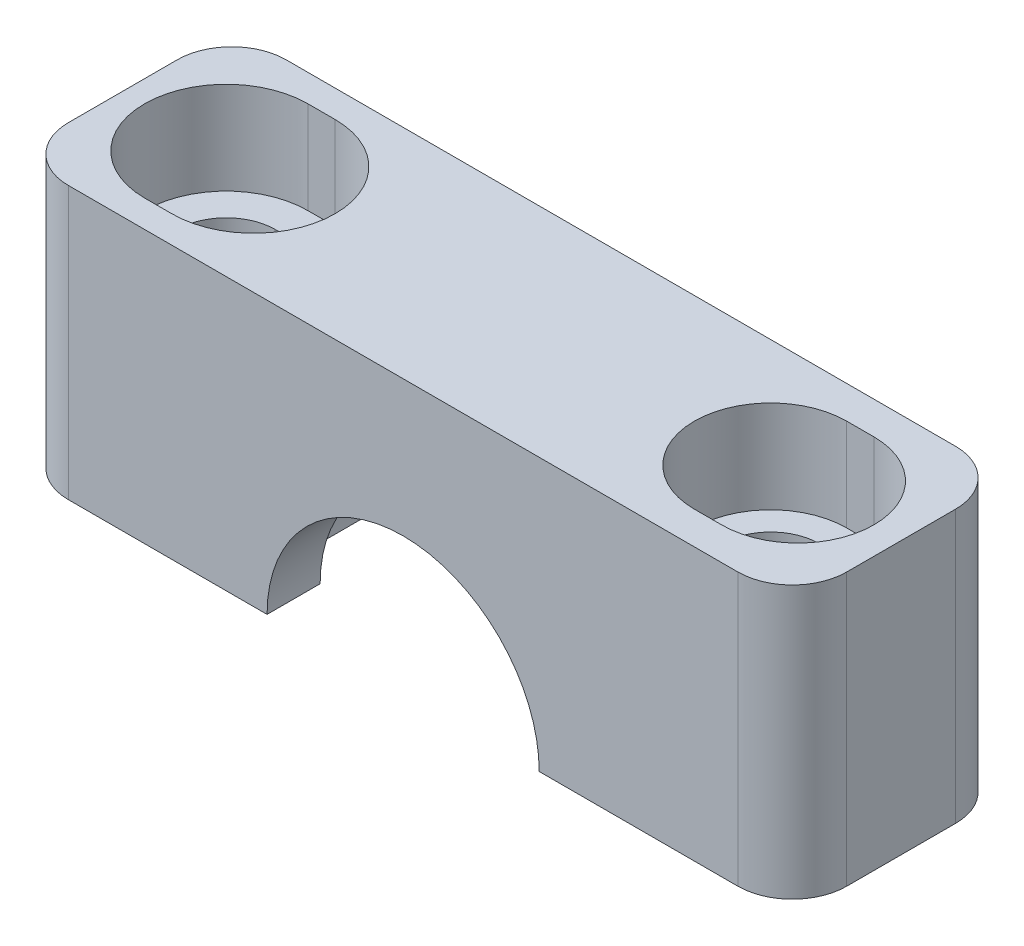
ISO-10303-21;
HEADER;
FILE_DESCRIPTION(('STEP AP214'),'2;1');
FILE_NAME('part.step','',(''),(''),'','','');
FILE_SCHEMA(('AUTOMOTIVE_DESIGN { 1 0 10303 214 1 1 1 1 }'));
ENDSEC;
DATA;
#1=APPLICATION_CONTEXT('core data for automotive mechanical design processes');
#2=APPLICATION_PROTOCOL_DEFINITION('international standard','automotive_design',2000,#1);
#3=PRODUCT_CONTEXT('',#1,'mechanical');
#4=PRODUCT('Part','Part','',(#3));
#5=PRODUCT_RELATED_PRODUCT_CATEGORY('part','',(#4));
#6=PRODUCT_DEFINITION_FORMATION('','',#4);
#7=PRODUCT_DEFINITION_CONTEXT('part definition',#1,'design');
#8=PRODUCT_DEFINITION('design','',#6,#7);
#9=PRODUCT_DEFINITION_SHAPE('','',#8);
#10=(LENGTH_UNIT() NAMED_UNIT(*) SI_UNIT(.MILLI.,.METRE.));
#11=(NAMED_UNIT(*) PLANE_ANGLE_UNIT() SI_UNIT($,.RADIAN.));
#12=(NAMED_UNIT(*) SI_UNIT($,.STERADIAN.) SOLID_ANGLE_UNIT());
#13=UNCERTAINTY_MEASURE_WITH_UNIT(LENGTH_MEASURE(1.E-05),#10,'distance_accuracy_value','');
#14=(GEOMETRIC_REPRESENTATION_CONTEXT(3) GLOBAL_UNCERTAINTY_ASSIGNED_CONTEXT((#13)) GLOBAL_UNIT_ASSIGNED_CONTEXT((#10,
#11,#12)) REPRESENTATION_CONTEXT('',''));
#15=CARTESIAN_POINT('',(0.,0.,0.));
#16=DIRECTION('',(0.,0.,1.));
#17=DIRECTION('',(1.,0.,0.));
#18=AXIS2_PLACEMENT_3D('',#15,#16,#17);
#19=CARTESIAN_POINT('',(12.065,12.7,0.));
#20=DIRECTION('',(0.,-1.,0.));
#21=DIRECTION('',(0.,0.,-1.));
#22=AXIS2_PLACEMENT_3D('',#19,#20,#21);
#23=CYLINDRICAL_SURFACE('',#22,2.28599999999999);
#24=CARTESIAN_POINT('',(12.065,8.382,0.));
#25=DIRECTION('',(0.,1.,0.));
#26=DIRECTION('',(0.,0.,1.));
#27=AXIS2_PLACEMENT_3D('',#24,#25,#26);
#28=CIRCLE('',#27,2.28599999999999);
#29=CARTESIAN_POINT('',(12.065,8.382,2.28599999999999));
#30=VERTEX_POINT('',#29);
#31=CARTESIAN_POINT('',(12.065,8.382,-2.28599999999999));
#32=VERTEX_POINT('',#31);
#33=EDGE_CURVE('E56',#30,#32,#28,.F.);
#34=ORIENTED_EDGE('',*,*,#33,.F.);
#35=DIRECTION('',(0.,-1.,0.));
#36=VECTOR('',#35,1.);
#37=CARTESIAN_POINT('',(12.065,12.7,2.28599999999999));
#38=LINE('',#37,#36);
#39=CARTESIAN_POINT('',(12.065,0.,2.28599999999999));
#40=VERTEX_POINT('',#39);
#41=EDGE_CURVE('E344',#30,#40,#38,.T.);
#42=ORIENTED_EDGE('',*,*,#41,.T.);
#43=CARTESIAN_POINT('',(12.065,0.,0.));
#44=DIRECTION('',(0.,-1.,0.));
#45=DIRECTION('',(0.,0.,-1.));
#46=AXIS2_PLACEMENT_3D('',#43,#44,#45);
#47=CIRCLE('',#46,2.28599999999999);
#48=CARTESIAN_POINT('',(12.065,0.,-2.28599999999999));
#49=VERTEX_POINT('',#48);
#50=EDGE_CURVE('E326',#40,#49,#47,.T.);
#51=ORIENTED_EDGE('',*,*,#50,.T.);
#52=DIRECTION('',(0.,-1.,0.));
#53=VECTOR('',#52,1.);
#54=CARTESIAN_POINT('',(12.065,12.7,-2.28599999999999));
#55=LINE('',#54,#53);
#56=EDGE_CURVE('E343',#32,#49,#55,.T.);
#57=ORIENTED_EDGE('',*,*,#56,.F.);
#58=EDGE_LOOP('',(#34,#42,#51,#57));
#59=FACE_BOUND('',#58,.T.);
#60=ADVANCED_FACE('F34',(#59),#23,.F.);
#61=CARTESIAN_POINT('',(12.065,12.7,2.28599999999999));
#62=DIRECTION('',(0.,0.,1.));
#63=DIRECTION('',(1.,0.,0.));
#64=AXIS2_PLACEMENT_3D('',#61,#62,#63);
#65=PLANE('',#64);
#66=DIRECTION('',(-1.,0.,0.));
#67=VECTOR('',#66,1.);
#68=CARTESIAN_POINT('',(12.065,8.382,2.28599999999999));
#69=LINE('',#68,#67);
#70=CARTESIAN_POINT('',(13.335,8.382,2.286));
#71=VERTEX_POINT('',#70);
#72=EDGE_CURVE('E270',#71,#30,#69,.T.);
#73=ORIENTED_EDGE('',*,*,#72,.F.);
#74=DIRECTION('',(0.,-1.,0.));
#75=VECTOR('',#74,1.);
#76=CARTESIAN_POINT('',(13.335,12.7,2.286));
#77=LINE('',#76,#75);
#78=CARTESIAN_POINT('',(13.335,0.,2.286));
#79=VERTEX_POINT('',#78);
#80=EDGE_CURVE('E347',#71,#79,#77,.T.);
#81=ORIENTED_EDGE('',*,*,#80,.T.);
#82=DIRECTION('',(-1.,0.,0.));
#83=VECTOR('',#82,1.);
#84=CARTESIAN_POINT('',(12.065,0.,2.28599999999999));
#85=LINE('',#84,#83);
#86=EDGE_CURVE('E340',#79,#40,#85,.T.);
#87=ORIENTED_EDGE('',*,*,#86,.T.);
#88=ORIENTED_EDGE('',*,*,#41,.F.);
#89=EDGE_LOOP('',(#73,#81,#87,#88));
#90=FACE_BOUND('',#89,.T.);
#91=ADVANCED_FACE('F487',(#90),#65,.F.);
#92=CARTESIAN_POINT('',(13.335,12.7,0.));
#93=DIRECTION('',(0.,-1.,0.));
#94=DIRECTION('',(0.,0.,-1.));
#95=AXIS2_PLACEMENT_3D('',#92,#93,#94);
#96=CYLINDRICAL_SURFACE('',#95,2.286);
#97=CARTESIAN_POINT('',(13.335,8.382,0.));
#98=DIRECTION('',(0.,1.,0.));
#99=DIRECTION('',(0.,0.,1.));
#100=AXIS2_PLACEMENT_3D('',#97,#98,#99);
#101=CIRCLE('',#100,2.286);
#102=CARTESIAN_POINT('',(13.335,8.382,-2.286));
#103=VERTEX_POINT('',#102);
#104=EDGE_CURVE('E265',#103,#71,#101,.F.);
#105=ORIENTED_EDGE('',*,*,#104,.F.);
#106=DIRECTION('',(0.,-1.,0.));
#107=VECTOR('',#106,1.);
#108=CARTESIAN_POINT('',(13.335,12.7,-2.286));
#109=LINE('',#108,#107);
#110=CARTESIAN_POINT('',(13.335,0.,-2.286));
#111=VERTEX_POINT('',#110);
#112=EDGE_CURVE('E349',#103,#111,#109,.T.);
#113=ORIENTED_EDGE('',*,*,#112,.T.);
#114=CARTESIAN_POINT('',(13.335,0.,0.));
#115=DIRECTION('',(0.,-1.,0.));
#116=DIRECTION('',(0.,0.,-1.));
#117=AXIS2_PLACEMENT_3D('',#114,#115,#116);
#118=CIRCLE('',#117,2.286);
#119=EDGE_CURVE('E337',#111,#79,#118,.T.);
#120=ORIENTED_EDGE('',*,*,#119,.T.);
#121=ORIENTED_EDGE('',*,*,#80,.F.);
#122=EDGE_LOOP('',(#105,#113,#120,#121));
#123=FACE_BOUND('',#122,.T.);
#124=ADVANCED_FACE('F481',(#123),#96,.F.);
#125=CARTESIAN_POINT('',(12.065,12.7,-2.28599999999999));
#126=DIRECTION('',(0.,0.,-1.));
#127=DIRECTION('',(-1.,0.,0.));
#128=AXIS2_PLACEMENT_3D('',#125,#126,#127);
#129=PLANE('',#128);
#130=DIRECTION('',(1.,0.,0.));
#131=VECTOR('',#130,1.);
#132=CARTESIAN_POINT('',(12.065,8.382,-2.28599999999999));
#133=LINE('',#132,#131);
#134=EDGE_CURVE('E11',#32,#103,#133,.T.);
#135=ORIENTED_EDGE('',*,*,#134,.F.);
#136=ORIENTED_EDGE('',*,*,#56,.T.);
#137=DIRECTION('',(1.,0.,0.));
#138=VECTOR('',#137,1.);
#139=CARTESIAN_POINT('',(12.065,0.,-2.28599999999999));
#140=LINE('',#139,#138);
#141=EDGE_CURVE('E334',#49,#111,#140,.T.);
#142=ORIENTED_EDGE('',*,*,#141,.T.);
#143=ORIENTED_EDGE('',*,*,#112,.F.);
#144=EDGE_LOOP('',(#135,#136,#142,#143));
#145=FACE_BOUND('',#144,.T.);
#146=ADVANCED_FACE('F474',(#145),#129,.F.);
#147=CARTESIAN_POINT('',(-13.335,12.7,0.));
#148=DIRECTION('',(0.,-1.,0.));
#149=DIRECTION('',(0.,0.,-1.));
#150=AXIS2_PLACEMENT_3D('',#147,#148,#149);
#151=CYLINDRICAL_SURFACE('',#150,2.286);
#152=CARTESIAN_POINT('',(-13.335,8.382,0.));
#153=DIRECTION('',(0.,1.,0.));
#154=DIRECTION('',(0.,0.,1.));
#155=AXIS2_PLACEMENT_3D('',#152,#153,#154);
#156=CIRCLE('',#155,2.286);
#157=CARTESIAN_POINT('',(-13.335,8.382,2.286));
#158=VERTEX_POINT('',#157);
#159=CARTESIAN_POINT('',(-13.335,8.382,-2.286));
#160=VERTEX_POINT('',#159);
#161=EDGE_CURVE('E309',#158,#160,#156,.F.);
#162=ORIENTED_EDGE('',*,*,#161,.F.);
#163=DIRECTION('',(0.,-1.,0.));
#164=VECTOR('',#163,1.);
#165=CARTESIAN_POINT('',(-13.335,12.7,2.286));
#166=LINE('',#165,#164);
#167=CARTESIAN_POINT('',(-13.335,0.,2.286));
#168=VERTEX_POINT('',#167);
#169=EDGE_CURVE('E324',#158,#168,#166,.T.);
#170=ORIENTED_EDGE('',*,*,#169,.T.);
#171=CARTESIAN_POINT('',(-13.335,0.,0.));
#172=DIRECTION('',(0.,-1.,0.));
#173=DIRECTION('',(0.,0.,-1.));
#174=AXIS2_PLACEMENT_3D('',#171,#172,#173);
#175=CIRCLE('',#174,2.286);
#176=CARTESIAN_POINT('',(-13.335,0.,-2.286));
#177=VERTEX_POINT('',#176);
#178=EDGE_CURVE('E311',#168,#177,#175,.T.);
#179=ORIENTED_EDGE('',*,*,#178,.T.);
#180=DIRECTION('',(0.,-1.,0.));
#181=VECTOR('',#180,1.);
#182=CARTESIAN_POINT('',(-13.335,12.7,-2.286));
#183=LINE('',#182,#181);
#184=EDGE_CURVE('E323',#160,#177,#183,.T.);
#185=ORIENTED_EDGE('',*,*,#184,.F.);
#186=EDGE_LOOP('',(#162,#170,#179,#185));
#187=FACE_BOUND('',#186,.T.);
#188=ADVANCED_FACE('F472',(#187),#151,.F.);
#189=CARTESIAN_POINT('',(-13.335,12.7,2.286));
#190=DIRECTION('',(0.,0.,1.));
#191=DIRECTION('',(1.,0.,0.));
#192=AXIS2_PLACEMENT_3D('',#189,#190,#191);
#193=PLANE('',#192);
#194=DIRECTION('',(-1.,0.,0.));
#195=VECTOR('',#194,1.);
#196=CARTESIAN_POINT('',(-13.335,8.382,2.286));
#197=LINE('',#196,#195);
#198=CARTESIAN_POINT('',(-12.065,8.382,2.286));
#199=VERTEX_POINT('',#198);
#200=EDGE_CURVE('E307',#199,#158,#197,.T.);
#201=ORIENTED_EDGE('',*,*,#200,.F.);
#202=DIRECTION('',(0.,-1.,0.));
#203=VECTOR('',#202,1.);
#204=CARTESIAN_POINT('',(-12.065,12.7,2.286));
#205=LINE('',#204,#203);
#206=CARTESIAN_POINT('',(-12.065,0.,2.286));
#207=VERTEX_POINT('',#206);
#208=EDGE_CURVE('E327',#199,#207,#205,.T.);
#209=ORIENTED_EDGE('',*,*,#208,.T.);
#210=DIRECTION('',(-1.,0.,0.));
#211=VECTOR('',#210,1.);
#212=CARTESIAN_POINT('',(-13.335,0.,2.286));
#213=LINE('',#212,#211);
#214=EDGE_CURVE('E320',#207,#168,#213,.T.);
#215=ORIENTED_EDGE('',*,*,#214,.T.);
#216=ORIENTED_EDGE('',*,*,#169,.F.);
#217=EDGE_LOOP('',(#201,#209,#215,#216));
#218=FACE_BOUND('',#217,.T.);
#219=ADVANCED_FACE('F470',(#218),#193,.F.);
#220=CARTESIAN_POINT('',(-12.065,12.7,0.));
#221=DIRECTION('',(0.,-1.,0.));
#222=DIRECTION('',(0.,0.,-1.));
#223=AXIS2_PLACEMENT_3D('',#220,#221,#222);
#224=CYLINDRICAL_SURFACE('',#223,2.286);
#225=CARTESIAN_POINT('',(-12.065,8.382,0.));
#226=DIRECTION('',(0.,1.,0.));
#227=DIRECTION('',(0.,0.,1.));
#228=AXIS2_PLACEMENT_3D('',#225,#226,#227);
#229=CIRCLE('',#228,2.286);
#230=CARTESIAN_POINT('',(-12.065,8.382,-2.286));
#231=VERTEX_POINT('',#230);
#232=EDGE_CURVE('E299',#231,#199,#229,.F.);
#233=ORIENTED_EDGE('',*,*,#232,.F.);
#234=DIRECTION('',(0.,-1.,0.));
#235=VECTOR('',#234,1.);
#236=CARTESIAN_POINT('',(-12.065,12.7,-2.286));
#237=LINE('',#236,#235);
#238=CARTESIAN_POINT('',(-12.065,0.,-2.286));
#239=VERTEX_POINT('',#238);
#240=EDGE_CURVE('E329',#231,#239,#237,.T.);
#241=ORIENTED_EDGE('',*,*,#240,.T.);
#242=CARTESIAN_POINT('',(-12.065,0.,0.));
#243=DIRECTION('',(0.,-1.,0.));
#244=DIRECTION('',(0.,0.,-1.));
#245=AXIS2_PLACEMENT_3D('',#242,#243,#244);
#246=CIRCLE('',#245,2.286);
#247=EDGE_CURVE('E317',#239,#207,#246,.T.);
#248=ORIENTED_EDGE('',*,*,#247,.T.);
#249=ORIENTED_EDGE('',*,*,#208,.F.);
#250=EDGE_LOOP('',(#233,#241,#248,#249));
#251=FACE_BOUND('',#250,.T.);
#252=ADVANCED_FACE('F459',(#251),#224,.F.);
#253=CARTESIAN_POINT('',(-13.335,12.7,-2.286));
#254=DIRECTION('',(0.,0.,-1.));
#255=DIRECTION('',(-1.,0.,0.));
#256=AXIS2_PLACEMENT_3D('',#253,#254,#255);
#257=PLANE('',#256);
#258=DIRECTION('',(1.,0.,0.));
#259=VECTOR('',#258,1.);
#260=CARTESIAN_POINT('',(-13.335,8.382,-2.286));
#261=LINE('',#260,#259);
#262=EDGE_CURVE('E42',#160,#231,#261,.T.);
#263=ORIENTED_EDGE('',*,*,#262,.F.);
#264=ORIENTED_EDGE('',*,*,#184,.T.);
#265=DIRECTION('',(1.,0.,0.));
#266=VECTOR('',#265,1.);
#267=CARTESIAN_POINT('',(-13.335,0.,-2.286));
#268=LINE('',#267,#266);
#269=EDGE_CURVE('E314',#177,#239,#268,.T.);
#270=ORIENTED_EDGE('',*,*,#269,.T.);
#271=ORIENTED_EDGE('',*,*,#240,.F.);
#272=EDGE_LOOP('',(#263,#264,#270,#271));
#273=FACE_BOUND('',#272,.T.);
#274=ADVANCED_FACE('F460',(#273),#257,.F.);
#275=CARTESIAN_POINT('',(0.,0.,-5.08));
#276=DIRECTION('',(0.,0.,1.));
#277=DIRECTION('',(1.,0.,0.));
#278=AXIS2_PLACEMENT_3D('',#275,#276,#277);
#279=CYLINDRICAL_SURFACE('',#278,6.35);
#280=CARTESIAN_POINT('',(0.,0.,2.6035));
#281=DIRECTION('',(0.,0.,-1.));
#282=DIRECTION('',(-1.,0.,0.));
#283=AXIS2_PLACEMENT_3D('',#280,#281,#282);
#284=CIRCLE('',#283,6.35);
#285=CARTESIAN_POINT('',(6.35,0.,2.6035));
#286=VERTEX_POINT('',#285);
#287=CARTESIAN_POINT('',(-6.35,0.,2.6035));
#288=VERTEX_POINT('',#287);
#289=EDGE_CURVE('E444',#286,#288,#284,.F.);
#290=ORIENTED_EDGE('',*,*,#289,.F.);
#291=DIRECTION('',(0.,0.,1.));
#292=VECTOR('',#291,1.);
#293=CARTESIAN_POINT('',(6.35,0.,-5.08));
#294=LINE('',#293,#292);
#295=CARTESIAN_POINT('',(6.35,0.,5.08));
#296=VERTEX_POINT('',#295);
#297=EDGE_CURVE('E379',#286,#296,#294,.T.);
#298=ORIENTED_EDGE('',*,*,#297,.T.);
#299=CARTESIAN_POINT('',(0.,0.,5.08));
#300=DIRECTION('',(0.,0.,1.));
#301=DIRECTION('',(-1.,0.,0.));
#302=AXIS2_PLACEMENT_3D('',#299,#300,#301);
#303=CIRCLE('',#302,6.35);
#304=CARTESIAN_POINT('',(-6.35,0.,5.08));
#305=VERTEX_POINT('',#304);
#306=EDGE_CURVE('E366',#296,#305,#303,.T.);
#307=ORIENTED_EDGE('',*,*,#306,.T.);
#308=DIRECTION('',(0.,0.,1.));
#309=VECTOR('',#308,1.);
#310=CARTESIAN_POINT('',(-6.35,0.,-5.08));
#311=LINE('',#310,#309);
#312=EDGE_CURVE('E372',#288,#305,#311,.T.);
#313=ORIENTED_EDGE('',*,*,#312,.F.);
#314=EDGE_LOOP('',(#290,#298,#307,#313));
#315=FACE_BOUND('',#314,.T.);
#316=ADVANCED_FACE('F512',(#315),#279,.F.);
#317=CARTESIAN_POINT('',(-15.621,0.,-2.54));
#318=DIRECTION('',(0.,-1.,0.));
#319=DIRECTION('',(0.,0.,-1.));
#320=AXIS2_PLACEMENT_3D('',#317,#318,#319);
#321=PLANE('',#320);
#322=ORIENTED_EDGE('',*,*,#50,.F.);
#323=ORIENTED_EDGE('',*,*,#86,.F.);
#324=ORIENTED_EDGE('',*,*,#119,.F.);
#325=ORIENTED_EDGE('',*,*,#141,.F.);
#326=EDGE_LOOP('',(#322,#323,#324,#325));
#327=FACE_BOUND('',#326,.T.);
#328=DIRECTION('',(1.,0.,0.));
#329=VECTOR('',#328,1.);
#330=CARTESIAN_POINT('',(-8.001,0.,-2.6035));
#331=LINE('',#330,#329);
#332=CARTESIAN_POINT('',(6.35,0.,-2.6035));
#333=VERTEX_POINT('',#332);
#334=CARTESIAN_POINT('',(8.001,0.,-2.6035));
#335=VERTEX_POINT('',#334);
#336=EDGE_CURVE('E355',#333,#335,#331,.T.);
#337=ORIENTED_EDGE('',*,*,#336,.F.);
#338=CARTESIAN_POINT('',(6.35,0.,-5.08));
#339=VERTEX_POINT('',#338);
#340=EDGE_CURVE('E375',#339,#333,#294,.T.);
#341=ORIENTED_EDGE('',*,*,#340,.F.);
#342=DIRECTION('',(-1.,0.,0.));
#343=VECTOR('',#342,1.);
#344=CARTESIAN_POINT('',(-15.621,0.,-5.08));
#345=LINE('',#344,#343);
#346=CARTESIAN_POINT('',(15.621,0.,-5.08));
#347=VERTEX_POINT('',#346);
#348=EDGE_CURVE('E387',#347,#339,#345,.T.);
#349=ORIENTED_EDGE('',*,*,#348,.F.);
#350=CARTESIAN_POINT('',(15.621,0.,-2.54));
#351=DIRECTION('',(0.,1.,0.));
#352=DIRECTION('',(0.,0.,-1.));
#353=AXIS2_PLACEMENT_3D('',#350,#351,#352);
#354=CIRCLE('',#353,2.54);
#355=CARTESIAN_POINT('',(18.161,0.,-2.53999999999998));
#356=VERTEX_POINT('',#355);
#357=EDGE_CURVE('E416',#356,#347,#354,.T.);
#358=ORIENTED_EDGE('',*,*,#357,.F.);
#359=DIRECTION('',(0.,0.,-1.));
#360=VECTOR('',#359,1.);
#361=CARTESIAN_POINT('',(18.161,0.,2.53999999999998));
#362=LINE('',#361,#360);
#363=CARTESIAN_POINT('',(18.161,0.,2.53999999999998));
#364=VERTEX_POINT('',#363);
#365=EDGE_CURVE('E414',#364,#356,#362,.T.);
#366=ORIENTED_EDGE('',*,*,#365,.F.);
#367=CARTESIAN_POINT('',(15.621,0.,2.54));
#368=DIRECTION('',(0.,1.,0.));
#369=DIRECTION('',(0.,0.,1.));
#370=AXIS2_PLACEMENT_3D('',#367,#368,#369);
#371=CIRCLE('',#370,2.54);
#372=CARTESIAN_POINT('',(15.621,0.,5.08));
#373=VERTEX_POINT('',#372);
#374=EDGE_CURVE('E412',#373,#364,#371,.T.);
#375=ORIENTED_EDGE('',*,*,#374,.F.);
#376=DIRECTION('',(1.,0.,0.));
#377=VECTOR('',#376,1.);
#378=CARTESIAN_POINT('',(-15.621,0.,5.08));
#379=LINE('',#378,#377);
#380=EDGE_CURVE('E408',#296,#373,#379,.T.);
#381=ORIENTED_EDGE('',*,*,#380,.F.);
#382=ORIENTED_EDGE('',*,*,#297,.F.);
#383=DIRECTION('',(1.,0.,0.));
#384=VECTOR('',#383,1.);
#385=CARTESIAN_POINT('',(-8.001,0.,2.6035));
#386=LINE('',#385,#384);
#387=CARTESIAN_POINT('',(8.001,0.,2.6035));
#388=VERTEX_POINT('',#387);
#389=EDGE_CURVE('E361',#286,#388,#386,.T.);
#390=ORIENTED_EDGE('',*,*,#389,.T.);
#391=DIRECTION('',(0.,0.,1.));
#392=VECTOR('',#391,1.);
#393=CARTESIAN_POINT('',(8.001,0.,-2.6035));
#394=LINE('',#393,#392);
#395=EDGE_CURVE('E364',#335,#388,#394,.T.);
#396=ORIENTED_EDGE('',*,*,#395,.F.);
#397=EDGE_LOOP('',(#337,#341,#349,#358,#366,#375,#381,#382,#390,#396));
#398=FACE_BOUND('',#397,.T.);
#399=ADVANCED_FACE('F520',(#327,#398),#321,.T.);
#400=CARTESIAN_POINT('',(-15.621,12.7,-2.54));
#401=DIRECTION('',(0.,-1.,0.));
#402=DIRECTION('',(0.,0.,-1.));
#403=AXIS2_PLACEMENT_3D('',#400,#401,#402);
#404=CYLINDRICAL_SURFACE('',#403,2.54);
#405=CARTESIAN_POINT('',(-15.621,0.,-2.54));
#406=DIRECTION('',(0.,1.,0.));
#407=DIRECTION('',(0.,0.,-1.));
#408=AXIS2_PLACEMENT_3D('',#405,#406,#407);
#409=CIRCLE('',#408,2.54);
#410=CARTESIAN_POINT('',(-15.621,0.,-5.08));
#411=VERTEX_POINT('',#410);
#412=CARTESIAN_POINT('',(-18.161,0.,-2.53999999999998));
#413=VERTEX_POINT('',#412);
#414=EDGE_CURVE('E378',#411,#413,#409,.T.);
#415=ORIENTED_EDGE('',*,*,#414,.T.);
#416=DIRECTION('',(0.,-1.,0.));
#417=VECTOR('',#416,1.);
#418=CARTESIAN_POINT('',(-18.161,12.7,-2.53999999999998));
#419=LINE('',#418,#417);
#420=CARTESIAN_POINT('',(-18.161,12.7,-2.53999999999998));
#421=VERTEX_POINT('',#420);
#422=EDGE_CURVE('E441',#421,#413,#419,.T.);
#423=ORIENTED_EDGE('',*,*,#422,.F.);
#424=CARTESIAN_POINT('',(-15.621,12.7,-2.54));
#425=DIRECTION('',(0.,1.,0.));
#426=DIRECTION('',(0.,0.,-1.));
#427=AXIS2_PLACEMENT_3D('',#424,#425,#426);
#428=CIRCLE('',#427,2.54);
#429=CARTESIAN_POINT('',(-15.621,12.7,-5.08));
#430=VERTEX_POINT('',#429);
#431=EDGE_CURVE('E383',#430,#421,#428,.T.);
#432=ORIENTED_EDGE('',*,*,#431,.F.);
#433=DIRECTION('',(0.,-1.,0.));
#434=VECTOR('',#433,1.);
#435=CARTESIAN_POINT('',(-15.621,12.7,-5.08));
#436=LINE('',#435,#434);
#437=EDGE_CURVE('E401',#430,#411,#436,.T.);
#438=ORIENTED_EDGE('',*,*,#437,.T.);
#439=EDGE_LOOP('',(#415,#423,#432,#438));
#440=FACE_BOUND('',#439,.T.);
#441=ADVANCED_FACE('F36',(#440),#404,.T.);
#442=CARTESIAN_POINT('',(-18.161,12.7,2.53999999999998));
#443=DIRECTION('',(1.,0.,0.));
#444=DIRECTION('',(0.,0.,-1.));
#445=AXIS2_PLACEMENT_3D('',#442,#443,#444);
#446=PLANE('',#445);
#447=DIRECTION('',(0.,0.,1.));
#448=VECTOR('',#447,1.);
#449=CARTESIAN_POINT('',(-18.161,0.,2.53999999999998));
#450=LINE('',#449,#448);
#451=CARTESIAN_POINT('',(-18.161,0.,2.53999999999998));
#452=VERTEX_POINT('',#451);
#453=EDGE_CURVE('E404',#413,#452,#450,.T.);
#454=ORIENTED_EDGE('',*,*,#453,.T.);
#455=DIRECTION('',(0.,-1.,0.));
#456=VECTOR('',#455,1.);
#457=CARTESIAN_POINT('',(-18.161,12.7,2.53999999999998));
#458=LINE('',#457,#456);
#459=CARTESIAN_POINT('',(-18.161,12.7,2.53999999999998));
#460=VERTEX_POINT('',#459);
#461=EDGE_CURVE('E438',#460,#452,#458,.T.);
#462=ORIENTED_EDGE('',*,*,#461,.F.);
#463=DIRECTION('',(0.,0.,1.));
#464=VECTOR('',#463,1.);
#465=CARTESIAN_POINT('',(-18.161,12.7,2.53999999999998));
#466=LINE('',#465,#464);
#467=EDGE_CURVE('E386',#421,#460,#466,.T.);
#468=ORIENTED_EDGE('',*,*,#467,.F.);
#469=ORIENTED_EDGE('',*,*,#422,.T.);
#470=EDGE_LOOP('',(#454,#462,#468,#469));
#471=FACE_BOUND('',#470,.T.);
#472=ADVANCED_FACE('F542',(#471),#446,.F.);
#473=CARTESIAN_POINT('',(-15.621,12.7,2.54));
#474=DIRECTION('',(0.,-1.,0.));
#475=DIRECTION('',(0.,0.,-1.));
#476=AXIS2_PLACEMENT_3D('',#473,#474,#475);
#477=CYLINDRICAL_SURFACE('',#476,2.54);
#478=CARTESIAN_POINT('',(-15.621,0.,2.54));
#479=DIRECTION('',(0.,1.,0.));
#480=DIRECTION('',(0.,0.,-1.));
#481=AXIS2_PLACEMENT_3D('',#478,#479,#480);
#482=CIRCLE('',#481,2.54);
#483=CARTESIAN_POINT('',(-15.621,0.,5.08));
#484=VERTEX_POINT('',#483);
#485=EDGE_CURVE('E406',#452,#484,#482,.T.);
#486=ORIENTED_EDGE('',*,*,#485,.T.);
#487=DIRECTION('',(0.,-1.,0.));
#488=VECTOR('',#487,1.);
#489=CARTESIAN_POINT('',(-15.621,12.7,5.08));
#490=LINE('',#489,#488);
#491=CARTESIAN_POINT('',(-15.621,12.7,5.08));
#492=VERTEX_POINT('',#491);
#493=EDGE_CURVE('E435',#492,#484,#490,.T.);
#494=ORIENTED_EDGE('',*,*,#493,.F.);
#495=CARTESIAN_POINT('',(-15.621,12.7,2.54));
#496=DIRECTION('',(0.,1.,0.));
#497=DIRECTION('',(0.,0.,-1.));
#498=AXIS2_PLACEMENT_3D('',#495,#496,#497);
#499=CIRCLE('',#498,2.54);
#500=EDGE_CURVE('E389',#460,#492,#499,.T.);
#501=ORIENTED_EDGE('',*,*,#500,.F.);
#502=ORIENTED_EDGE('',*,*,#461,.T.);
#503=EDGE_LOOP('',(#486,#494,#501,#502));
#504=FACE_BOUND('',#503,.T.);
#505=ADVANCED_FACE('F539',(#504),#477,.T.);
#506=CARTESIAN_POINT('',(-15.621,12.7,5.08));
#507=DIRECTION('',(0.,0.,-1.));
#508=DIRECTION('',(-1.,0.,0.));
#509=AXIS2_PLACEMENT_3D('',#506,#507,#508);
#510=PLANE('',#509);
#511=EDGE_CURVE('E409',#484,#305,#379,.T.);
#512=ORIENTED_EDGE('',*,*,#511,.T.);
#513=ORIENTED_EDGE('',*,*,#306,.F.);
#514=ORIENTED_EDGE('',*,*,#380,.T.);
#515=DIRECTION('',(0.,-1.,0.));
#516=VECTOR('',#515,1.);
#517=CARTESIAN_POINT('',(15.621,12.7,5.08));
#518=LINE('',#517,#516);
#519=CARTESIAN_POINT('',(15.621,12.7,5.08));
#520=VERTEX_POINT('',#519);
#521=EDGE_CURVE('E432',#520,#373,#518,.T.);
#522=ORIENTED_EDGE('',*,*,#521,.F.);
#523=DIRECTION('',(1.,0.,0.));
#524=VECTOR('',#523,1.);
#525=CARTESIAN_POINT('',(-15.621,12.7,5.08));
#526=LINE('',#525,#524);
#527=EDGE_CURVE('E391',#492,#520,#526,.T.);
#528=ORIENTED_EDGE('',*,*,#527,.F.);
#529=ORIENTED_EDGE('',*,*,#493,.T.);
#530=EDGE_LOOP('',(#512,#513,#514,#522,#528,#529));
#531=FACE_BOUND('',#530,.T.);
#532=ADVANCED_FACE('F535',(#531),#510,.F.);
#533=CARTESIAN_POINT('',(15.621,12.7,2.54));
#534=DIRECTION('',(0.,-1.,0.));
#535=DIRECTION('',(0.,0.,-1.));
#536=AXIS2_PLACEMENT_3D('',#533,#534,#535);
#537=CYLINDRICAL_SURFACE('',#536,2.54);
#538=ORIENTED_EDGE('',*,*,#374,.T.);
#539=DIRECTION('',(0.,-1.,0.));
#540=VECTOR('',#539,1.);
#541=CARTESIAN_POINT('',(18.161,12.7,2.53999999999998));
#542=LINE('',#541,#540);
#543=CARTESIAN_POINT('',(18.161,12.7,2.53999999999998));
#544=VERTEX_POINT('',#543);
#545=EDGE_CURVE('E429',#544,#364,#542,.T.);
#546=ORIENTED_EDGE('',*,*,#545,.F.);
#547=CARTESIAN_POINT('',(15.621,12.7,2.54));
#548=DIRECTION('',(0.,1.,0.));
#549=DIRECTION('',(0.,0.,1.));
#550=AXIS2_PLACEMENT_3D('',#547,#548,#549);
#551=CIRCLE('',#550,2.54);
#552=EDGE_CURVE('E393',#520,#544,#551,.T.);
#553=ORIENTED_EDGE('',*,*,#552,.F.);
#554=ORIENTED_EDGE('',*,*,#521,.T.);
#555=EDGE_LOOP('',(#538,#546,#553,#554));
#556=FACE_BOUND('',#555,.T.);
#557=ADVANCED_FACE('F531',(#556),#537,.T.);
#558=CARTESIAN_POINT('',(18.161,12.7,2.53999999999998));
#559=DIRECTION('',(-1.,0.,0.));
#560=DIRECTION('',(0.,0.,1.));
#561=AXIS2_PLACEMENT_3D('',#558,#559,#560);
#562=PLANE('',#561);
#563=ORIENTED_EDGE('',*,*,#365,.T.);
#564=DIRECTION('',(0.,-1.,0.));
#565=VECTOR('',#564,1.);
#566=CARTESIAN_POINT('',(18.161,12.7,-2.53999999999998));
#567=LINE('',#566,#565);
#568=CARTESIAN_POINT('',(18.161,12.7,-2.53999999999998));
#569=VERTEX_POINT('',#568);
#570=EDGE_CURVE('E426',#569,#356,#567,.T.);
#571=ORIENTED_EDGE('',*,*,#570,.F.);
#572=DIRECTION('',(0.,0.,-1.));
#573=VECTOR('',#572,1.);
#574=CARTESIAN_POINT('',(18.161,12.7,2.53999999999998));
#575=LINE('',#574,#573);
#576=EDGE_CURVE('E395',#544,#569,#575,.T.);
#577=ORIENTED_EDGE('',*,*,#576,.F.);
#578=ORIENTED_EDGE('',*,*,#545,.T.);
#579=EDGE_LOOP('',(#563,#571,#577,#578));
#580=FACE_BOUND('',#579,.T.);
#581=ADVANCED_FACE('F527',(#580),#562,.F.);
#582=CARTESIAN_POINT('',(15.621,12.7,-2.54));
#583=DIRECTION('',(0.,-1.,0.));
#584=DIRECTION('',(0.,0.,-1.));
#585=AXIS2_PLACEMENT_3D('',#582,#583,#584);
#586=CYLINDRICAL_SURFACE('',#585,2.54);
#587=ORIENTED_EDGE('',*,*,#357,.T.);
#588=DIRECTION('',(0.,-1.,0.));
#589=VECTOR('',#588,1.);
#590=CARTESIAN_POINT('',(15.621,12.7,-5.08));
#591=LINE('',#590,#589);
#592=CARTESIAN_POINT('',(15.621,12.7,-5.08));
#593=VERTEX_POINT('',#592);
#594=EDGE_CURVE('E423',#593,#347,#591,.T.);
#595=ORIENTED_EDGE('',*,*,#594,.F.);
#596=CARTESIAN_POINT('',(15.621,12.7,-2.54));
#597=DIRECTION('',(0.,1.,0.));
#598=DIRECTION('',(0.,0.,-1.));
#599=AXIS2_PLACEMENT_3D('',#596,#597,#598);
#600=CIRCLE('',#599,2.54);
#601=EDGE_CURVE('E397',#569,#593,#600,.T.);
#602=ORIENTED_EDGE('',*,*,#601,.F.);
#603=ORIENTED_EDGE('',*,*,#570,.T.);
#604=EDGE_LOOP('',(#587,#595,#602,#603));
#605=FACE_BOUND('',#604,.T.);
#606=ADVANCED_FACE('F523',(#605),#586,.T.);
#607=CARTESIAN_POINT('',(-15.621,12.7,-5.08));
#608=DIRECTION('',(0.,0.,1.));
#609=DIRECTION('',(1.,0.,0.));
#610=AXIS2_PLACEMENT_3D('',#607,#608,#609);
#611=PLANE('',#610);
#612=ORIENTED_EDGE('',*,*,#348,.T.);
#613=CARTESIAN_POINT('',(0.,0.,-5.08));
#614=DIRECTION('',(0.,0.,1.));
#615=DIRECTION('',(-1.,0.,0.));
#616=AXIS2_PLACEMENT_3D('',#613,#614,#615);
#617=CIRCLE('',#616,6.35);
#618=CARTESIAN_POINT('',(-6.35,0.,-5.08));
#619=VERTEX_POINT('',#618);
#620=EDGE_CURVE('E369',#339,#619,#617,.T.);
#621=ORIENTED_EDGE('',*,*,#620,.T.);
#622=EDGE_CURVE('E418',#619,#411,#345,.T.);
#623=ORIENTED_EDGE('',*,*,#622,.T.);
#624=ORIENTED_EDGE('',*,*,#437,.F.);
#625=DIRECTION('',(-1.,0.,0.));
#626=VECTOR('',#625,1.);
#627=CARTESIAN_POINT('',(-15.621,12.7,-5.08));
#628=LINE('',#627,#626);
#629=EDGE_CURVE('E399',#593,#430,#628,.T.);
#630=ORIENTED_EDGE('',*,*,#629,.F.);
#631=ORIENTED_EDGE('',*,*,#594,.T.);
#632=EDGE_LOOP('',(#612,#621,#623,#624,#630,#631));
#633=FACE_BOUND('',#632,.T.);
#634=ADVANCED_FACE('F516',(#633),#611,.F.);
#635=CARTESIAN_POINT('',(-15.621,12.7,-2.54));
#636=DIRECTION('',(0.,-1.,0.));
#637=DIRECTION('',(0.,0.,-1.));
#638=AXIS2_PLACEMENT_3D('',#635,#636,#637);
#639=PLANE('',#638);
#640=DIRECTION('',(1.,0.,0.));
#641=VECTOR('',#640,1.);
#642=CARTESIAN_POINT('',(12.065,12.7,3.55599999999999));
#643=LINE('',#642,#641);
#644=CARTESIAN_POINT('',(12.065,12.7,3.55599999999999));
#645=VERTEX_POINT('',#644);
#646=CARTESIAN_POINT('',(13.335,12.7,3.556));
#647=VERTEX_POINT('',#646);
#648=EDGE_CURVE('E259',#645,#647,#643,.T.);
#649=ORIENTED_EDGE('',*,*,#648,.F.);
#650=CARTESIAN_POINT('',(12.065,12.7,0.));
#651=DIRECTION('',(0.,1.,0.));
#652=DIRECTION('',(0.,0.,1.));
#653=AXIS2_PLACEMENT_3D('',#650,#651,#652);
#654=CIRCLE('',#653,3.55599999999999);
#655=CARTESIAN_POINT('',(12.065,12.7,-3.55599999999999));
#656=VERTEX_POINT('',#655);
#657=EDGE_CURVE('E49',#656,#645,#654,.T.);
#658=ORIENTED_EDGE('',*,*,#657,.F.);
#659=DIRECTION('',(-1.,0.,0.));
#660=VECTOR('',#659,1.);
#661=CARTESIAN_POINT('',(13.335,12.7,-3.556));
#662=LINE('',#661,#660);
#663=CARTESIAN_POINT('',(13.335,12.7,-3.556));
#664=VERTEX_POINT('',#663);
#665=EDGE_CURVE('E250',#664,#656,#662,.T.);
#666=ORIENTED_EDGE('',*,*,#665,.F.);
#667=CARTESIAN_POINT('',(13.335,12.7,0.));
#668=DIRECTION('',(0.,1.,0.));
#669=DIRECTION('',(0.,0.,1.));
#670=AXIS2_PLACEMENT_3D('',#667,#668,#669);
#671=CIRCLE('',#670,3.556);
#672=EDGE_CURVE('E253',#647,#664,#671,.T.);
#673=ORIENTED_EDGE('',*,*,#672,.F.);
#674=EDGE_LOOP('',(#649,#658,#666,#673));
#675=FACE_BOUND('',#674,.T.);
#676=DIRECTION('',(1.,0.,0.));
#677=VECTOR('',#676,1.);
#678=CARTESIAN_POINT('',(-13.335,12.7,3.81));
#679=LINE('',#678,#677);
#680=CARTESIAN_POINT('',(-13.335,12.7,3.81));
#681=VERTEX_POINT('',#680);
#682=CARTESIAN_POINT('',(-12.065,12.7,3.81));
#683=VERTEX_POINT('',#682);
#684=EDGE_CURVE('E289',#681,#683,#679,.T.);
#685=ORIENTED_EDGE('',*,*,#684,.F.);
#686=CARTESIAN_POINT('',(-13.335,12.7,0.));
#687=DIRECTION('',(0.,1.,0.));
#688=DIRECTION('',(0.,0.,1.));
#689=AXIS2_PLACEMENT_3D('',#686,#687,#688);
#690=CIRCLE('',#689,3.81);
#691=CARTESIAN_POINT('',(-13.335,12.7,-3.80999999999999));
#692=VERTEX_POINT('',#691);
#693=EDGE_CURVE('E273',#692,#681,#690,.T.);
#694=ORIENTED_EDGE('',*,*,#693,.F.);
#695=DIRECTION('',(-1.,0.,0.));
#696=VECTOR('',#695,1.);
#697=CARTESIAN_POINT('',(-12.065,12.7,-3.81));
#698=LINE('',#697,#696);
#699=CARTESIAN_POINT('',(-12.065,12.7,-3.81));
#700=VERTEX_POINT('',#699);
#701=EDGE_CURVE('E278',#700,#692,#698,.T.);
#702=ORIENTED_EDGE('',*,*,#701,.F.);
#703=CARTESIAN_POINT('',(-12.065,12.7,0.));
#704=DIRECTION('',(0.,1.,0.));
#705=DIRECTION('',(0.,0.,1.));
#706=AXIS2_PLACEMENT_3D('',#703,#704,#705);
#707=CIRCLE('',#706,3.81);
#708=EDGE_CURVE('E292',#683,#700,#707,.T.);
#709=ORIENTED_EDGE('',*,*,#708,.F.);
#710=EDGE_LOOP('',(#685,#694,#702,#709));
#711=FACE_BOUND('',#710,.T.);
#712=ORIENTED_EDGE('',*,*,#431,.T.);
#713=ORIENTED_EDGE('',*,*,#467,.T.);
#714=ORIENTED_EDGE('',*,*,#500,.T.);
#715=ORIENTED_EDGE('',*,*,#527,.T.);
#716=ORIENTED_EDGE('',*,*,#552,.T.);
#717=ORIENTED_EDGE('',*,*,#576,.T.);
#718=ORIENTED_EDGE('',*,*,#601,.T.);
#719=ORIENTED_EDGE('',*,*,#629,.T.);
#720=EDGE_LOOP('',(#712,#713,#714,#715,#716,#717,#718,#719));
#721=FACE_BOUND('',#720,.T.);
#722=ADVANCED_FACE('F513',(#675,#711,#721),#639,.F.);
#723=ORIENTED_EDGE('',*,*,#178,.F.);
#724=ORIENTED_EDGE('',*,*,#214,.F.);
#725=ORIENTED_EDGE('',*,*,#247,.F.);
#726=ORIENTED_EDGE('',*,*,#269,.F.);
#727=EDGE_LOOP('',(#723,#724,#725,#726));
#728=FACE_BOUND('',#727,.T.);
#729=CARTESIAN_POINT('',(-8.001,0.,-2.6035));
#730=VERTEX_POINT('',#729);
#731=CARTESIAN_POINT('',(-6.35,0.,-2.6035));
#732=VERTEX_POINT('',#731);
#733=EDGE_CURVE('E357',#730,#732,#331,.T.);
#734=ORIENTED_EDGE('',*,*,#733,.F.);
#735=DIRECTION('',(0.,0.,1.));
#736=VECTOR('',#735,1.);
#737=CARTESIAN_POINT('',(-8.001,0.,-2.6035));
#738=LINE('',#737,#736);
#739=CARTESIAN_POINT('',(-8.001,0.,2.6035));
#740=VERTEX_POINT('',#739);
#741=EDGE_CURVE('E359',#730,#740,#738,.T.);
#742=ORIENTED_EDGE('',*,*,#741,.T.);
#743=EDGE_CURVE('E356',#740,#288,#386,.T.);
#744=ORIENTED_EDGE('',*,*,#743,.T.);
#745=ORIENTED_EDGE('',*,*,#312,.T.);
#746=ORIENTED_EDGE('',*,*,#511,.F.);
#747=ORIENTED_EDGE('',*,*,#485,.F.);
#748=ORIENTED_EDGE('',*,*,#453,.F.);
#749=ORIENTED_EDGE('',*,*,#414,.F.);
#750=ORIENTED_EDGE('',*,*,#622,.F.);
#751=EDGE_CURVE('E380',#619,#732,#311,.T.);
#752=ORIENTED_EDGE('',*,*,#751,.T.);
#753=EDGE_LOOP('',(#734,#742,#744,#745,#746,#747,#748,#749,#750,#752));
#754=FACE_BOUND('',#753,.T.);
#755=ADVANCED_FACE('F466',(#728,#754),#321,.T.);
#756=ORIENTED_EDGE('',*,*,#340,.T.);
#757=CARTESIAN_POINT('',(0.,0.,-2.6035));
#758=DIRECTION('',(0.,0.,-1.));
#759=DIRECTION('',(-1.,0.,0.));
#760=AXIS2_PLACEMENT_3D('',#757,#758,#759);
#761=CIRCLE('',#760,6.35);
#762=EDGE_CURVE('E446',#333,#732,#761,.F.);
#763=ORIENTED_EDGE('',*,*,#762,.T.);
#764=ORIENTED_EDGE('',*,*,#751,.F.);
#765=ORIENTED_EDGE('',*,*,#620,.F.);
#766=EDGE_LOOP('',(#756,#763,#764,#765));
#767=FACE_BOUND('',#766,.T.);
#768=ADVANCED_FACE('F500',(#767),#279,.F.);
#769=CARTESIAN_POINT('',(0.,0.,-2.6035));
#770=DIRECTION('',(0.,0.,-1.));
#771=DIRECTION('',(-1.,0.,0.));
#772=AXIS2_PLACEMENT_3D('',#769,#770,#771);
#773=PLANE('',#772);
#774=ORIENTED_EDGE('',*,*,#336,.T.);
#775=CARTESIAN_POINT('',(0.,0.,-2.6035));
#776=DIRECTION('',(0.,0.,1.));
#777=DIRECTION('',(-1.,0.,0.));
#778=AXIS2_PLACEMENT_3D('',#775,#776,#777);
#779=CIRCLE('',#778,8.001);
#780=EDGE_CURVE('E352',#335,#730,#779,.T.);
#781=ORIENTED_EDGE('',*,*,#780,.T.);
#782=ORIENTED_EDGE('',*,*,#733,.T.);
#783=ORIENTED_EDGE('',*,*,#762,.F.);
#784=EDGE_LOOP('',(#774,#781,#782,#783));
#785=FACE_BOUND('',#784,.T.);
#786=ADVANCED_FACE('F496',(#785),#773,.F.);
#787=CARTESIAN_POINT('',(0.,0.,2.6035));
#788=DIRECTION('',(0.,0.,-1.));
#789=DIRECTION('',(-1.,0.,0.));
#790=AXIS2_PLACEMENT_3D('',#787,#788,#789);
#791=PLANE('',#790);
#792=ORIENTED_EDGE('',*,*,#289,.T.);
#793=ORIENTED_EDGE('',*,*,#743,.F.);
#794=CARTESIAN_POINT('',(0.,0.,2.6035));
#795=DIRECTION('',(0.,0.,1.));
#796=DIRECTION('',(-1.,0.,0.));
#797=AXIS2_PLACEMENT_3D('',#794,#795,#796);
#798=CIRCLE('',#797,8.001);
#799=EDGE_CURVE('E346',#388,#740,#798,.T.);
#800=ORIENTED_EDGE('',*,*,#799,.F.);
#801=ORIENTED_EDGE('',*,*,#389,.F.);
#802=EDGE_LOOP('',(#792,#793,#800,#801));
#803=FACE_BOUND('',#802,.T.);
#804=ADVANCED_FACE('F499',(#803),#791,.T.);
#805=CARTESIAN_POINT('',(0.,0.,-2.6035));
#806=DIRECTION('',(0.,0.,1.));
#807=DIRECTION('',(1.,0.,0.));
#808=AXIS2_PLACEMENT_3D('',#805,#806,#807);
#809=CYLINDRICAL_SURFACE('',#808,8.001);
#810=ORIENTED_EDGE('',*,*,#799,.T.);
#811=ORIENTED_EDGE('',*,*,#741,.F.);
#812=ORIENTED_EDGE('',*,*,#780,.F.);
#813=ORIENTED_EDGE('',*,*,#395,.T.);
#814=EDGE_LOOP('',(#810,#811,#812,#813));
#815=FACE_BOUND('',#814,.T.);
#816=ADVANCED_FACE('F504',(#815),#809,.F.);
#817=CARTESIAN_POINT('',(-13.335,8.382,0.));
#818=DIRECTION('',(0.,1.,0.));
#819=DIRECTION('',(0.,0.,1.));
#820=AXIS2_PLACEMENT_3D('',#817,#818,#819);
#821=PLANE('',#820);
#822=CARTESIAN_POINT('',(-13.335,8.382,0.));
#823=DIRECTION('',(0.,1.,0.));
#824=DIRECTION('',(0.,0.,1.));
#825=AXIS2_PLACEMENT_3D('',#822,#823,#824);
#826=CIRCLE('',#825,3.81);
#827=CARTESIAN_POINT('',(-13.335,8.382,-3.80999999999999));
#828=VERTEX_POINT('',#827);
#829=CARTESIAN_POINT('',(-13.335,8.382,3.81));
#830=VERTEX_POINT('',#829);
#831=EDGE_CURVE('E274',#828,#830,#826,.T.);
#832=ORIENTED_EDGE('',*,*,#831,.T.);
#833=DIRECTION('',(1.,0.,0.));
#834=VECTOR('',#833,1.);
#835=CARTESIAN_POINT('',(-13.335,8.382,3.81));
#836=LINE('',#835,#834);
#837=CARTESIAN_POINT('',(-12.065,8.382,3.81));
#838=VERTEX_POINT('',#837);
#839=EDGE_CURVE('E277',#830,#838,#836,.T.);
#840=ORIENTED_EDGE('',*,*,#839,.T.);
#841=CARTESIAN_POINT('',(-12.065,8.382,0.));
#842=DIRECTION('',(0.,1.,0.));
#843=DIRECTION('',(0.,0.,1.));
#844=AXIS2_PLACEMENT_3D('',#841,#842,#843);
#845=CIRCLE('',#844,3.81);
#846=CARTESIAN_POINT('',(-12.065,8.382,-3.81));
#847=VERTEX_POINT('',#846);
#848=EDGE_CURVE('E281',#838,#847,#845,.T.);
#849=ORIENTED_EDGE('',*,*,#848,.T.);
#850=DIRECTION('',(-1.,0.,0.));
#851=VECTOR('',#850,1.);
#852=CARTESIAN_POINT('',(-12.065,8.382,-3.81));
#853=LINE('',#852,#851);
#854=EDGE_CURVE('E284',#847,#828,#853,.T.);
#855=ORIENTED_EDGE('',*,*,#854,.T.);
#856=EDGE_LOOP('',(#832,#840,#849,#855));
#857=FACE_BOUND('',#856,.T.);
#858=ORIENTED_EDGE('',*,*,#161,.T.);
#859=ORIENTED_EDGE('',*,*,#262,.T.);
#860=ORIENTED_EDGE('',*,*,#232,.T.);
#861=ORIENTED_EDGE('',*,*,#200,.T.);
#862=EDGE_LOOP('',(#858,#859,#860,#861));
#863=FACE_BOUND('',#862,.T.);
#864=ADVANCED_FACE('F451',(#857,#863),#821,.T.);
#865=CARTESIAN_POINT('',(-13.335,8.382,0.));
#866=DIRECTION('',(0.,1.,0.));
#867=DIRECTION('',(0.,0.,1.));
#868=AXIS2_PLACEMENT_3D('',#865,#866,#867);
#869=CYLINDRICAL_SURFACE('',#868,3.81);
#870=ORIENTED_EDGE('',*,*,#693,.T.);
#871=DIRECTION('',(0.,1.,0.));
#872=VECTOR('',#871,1.);
#873=CARTESIAN_POINT('',(-13.335,8.382,3.81));
#874=LINE('',#873,#872);
#875=EDGE_CURVE('E287',#830,#681,#874,.T.);
#876=ORIENTED_EDGE('',*,*,#875,.F.);
#877=ORIENTED_EDGE('',*,*,#831,.F.);
#878=DIRECTION('',(0.,1.,0.));
#879=VECTOR('',#878,1.);
#880=CARTESIAN_POINT('',(-13.335,8.382,-3.80999999999999));
#881=LINE('',#880,#879);
#882=EDGE_CURVE('E297',#828,#692,#881,.T.);
#883=ORIENTED_EDGE('',*,*,#882,.T.);
#884=EDGE_LOOP('',(#870,#876,#877,#883));
#885=FACE_BOUND('',#884,.T.);
#886=ADVANCED_FACE('F600',(#885),#869,.F.);
#887=CARTESIAN_POINT('',(-12.065,8.382,-3.81));
#888=DIRECTION('',(0.,0.,-1.));
#889=DIRECTION('',(-1.,0.,0.));
#890=AXIS2_PLACEMENT_3D('',#887,#888,#889);
#891=PLANE('',#890);
#892=ORIENTED_EDGE('',*,*,#701,.T.);
#893=ORIENTED_EDGE('',*,*,#882,.F.);
#894=ORIENTED_EDGE('',*,*,#854,.F.);
#895=DIRECTION('',(0.,1.,0.));
#896=VECTOR('',#895,1.);
#897=CARTESIAN_POINT('',(-12.065,8.382,-3.81));
#898=LINE('',#897,#896);
#899=EDGE_CURVE('E300',#847,#700,#898,.T.);
#900=ORIENTED_EDGE('',*,*,#899,.T.);
#901=EDGE_LOOP('',(#892,#893,#894,#900));
#902=FACE_BOUND('',#901,.T.);
#903=ADVANCED_FACE('F603',(#902),#891,.F.);
#904=CARTESIAN_POINT('',(-12.065,8.382,0.));
#905=DIRECTION('',(0.,1.,0.));
#906=DIRECTION('',(0.,0.,1.));
#907=AXIS2_PLACEMENT_3D('',#904,#905,#906);
#908=CYLINDRICAL_SURFACE('',#907,3.81);
#909=ORIENTED_EDGE('',*,*,#708,.T.);
#910=ORIENTED_EDGE('',*,*,#899,.F.);
#911=ORIENTED_EDGE('',*,*,#848,.F.);
#912=DIRECTION('',(0.,1.,0.));
#913=VECTOR('',#912,1.);
#914=CARTESIAN_POINT('',(-12.065,8.382,3.81));
#915=LINE('',#914,#913);
#916=EDGE_CURVE('E302',#838,#683,#915,.T.);
#917=ORIENTED_EDGE('',*,*,#916,.T.);
#918=EDGE_LOOP('',(#909,#910,#911,#917));
#919=FACE_BOUND('',#918,.T.);
#920=ADVANCED_FACE('F608',(#919),#908,.F.);
#921=CARTESIAN_POINT('',(-13.335,8.382,3.81));
#922=DIRECTION('',(0.,0.,1.));
#923=DIRECTION('',(1.,0.,0.));
#924=AXIS2_PLACEMENT_3D('',#921,#922,#923);
#925=PLANE('',#924);
#926=ORIENTED_EDGE('',*,*,#684,.T.);
#927=ORIENTED_EDGE('',*,*,#916,.F.);
#928=ORIENTED_EDGE('',*,*,#839,.F.);
#929=ORIENTED_EDGE('',*,*,#875,.T.);
#930=EDGE_LOOP('',(#926,#927,#928,#929));
#931=FACE_BOUND('',#930,.T.);
#932=ADVANCED_FACE('F605',(#931),#925,.F.);
#933=CARTESIAN_POINT('',(12.065,8.382,0.));
#934=DIRECTION('',(0.,1.,0.));
#935=DIRECTION('',(0.,0.,1.));
#936=AXIS2_PLACEMENT_3D('',#933,#934,#935);
#937=PLANE('',#936);
#938=CARTESIAN_POINT('',(12.065,8.382,0.));
#939=DIRECTION('',(0.,1.,0.));
#940=DIRECTION('',(0.,0.,1.));
#941=AXIS2_PLACEMENT_3D('',#938,#939,#940);
#942=CIRCLE('',#941,3.55599999999999);
#943=CARTESIAN_POINT('',(12.065,8.382,-3.55599999999999));
#944=VERTEX_POINT('',#943);
#945=CARTESIAN_POINT('',(12.065,8.382,3.55599999999999));
#946=VERTEX_POINT('',#945);
#947=EDGE_CURVE('E232',#944,#946,#942,.T.);
#948=ORIENTED_EDGE('',*,*,#947,.T.);
#949=DIRECTION('',(1.,0.,0.));
#950=VECTOR('',#949,1.);
#951=CARTESIAN_POINT('',(12.065,8.382,3.55599999999999));
#952=LINE('',#951,#950);
#953=CARTESIAN_POINT('',(13.335,8.382,3.556));
#954=VERTEX_POINT('',#953);
#955=EDGE_CURVE('E241',#946,#954,#952,.T.);
#956=ORIENTED_EDGE('',*,*,#955,.T.);
#957=CARTESIAN_POINT('',(13.335,8.382,0.));
#958=DIRECTION('',(0.,1.,0.));
#959=DIRECTION('',(0.,0.,1.));
#960=AXIS2_PLACEMENT_3D('',#957,#958,#959);
#961=CIRCLE('',#960,3.556);
#962=CARTESIAN_POINT('',(13.335,8.382,-3.556));
#963=VERTEX_POINT('',#962);
#964=EDGE_CURVE('E246',#954,#963,#961,.T.);
#965=ORIENTED_EDGE('',*,*,#964,.T.);
#966=DIRECTION('',(-1.,0.,0.));
#967=VECTOR('',#966,1.);
#968=CARTESIAN_POINT('',(13.335,8.382,-3.556));
#969=LINE('',#968,#967);
#970=EDGE_CURVE('E238',#963,#944,#969,.T.);
#971=ORIENTED_EDGE('',*,*,#970,.T.);
#972=EDGE_LOOP('',(#948,#956,#965,#971));
#973=FACE_BOUND('',#972,.T.);
#974=ORIENTED_EDGE('',*,*,#33,.T.);
#975=ORIENTED_EDGE('',*,*,#134,.T.);
#976=ORIENTED_EDGE('',*,*,#104,.T.);
#977=ORIENTED_EDGE('',*,*,#72,.T.);
#978=EDGE_LOOP('',(#974,#975,#976,#977));
#979=FACE_BOUND('',#978,.T.);
#980=ADVANCED_FACE('F248',(#973,#979),#937,.T.);
#981=CARTESIAN_POINT('',(12.065,8.382,0.));
#982=DIRECTION('',(0.,1.,0.));
#983=DIRECTION('',(0.,0.,1.));
#984=AXIS2_PLACEMENT_3D('',#981,#982,#983);
#985=CYLINDRICAL_SURFACE('',#984,3.55599999999999);
#986=ORIENTED_EDGE('',*,*,#657,.T.);
#987=DIRECTION('',(0.,1.,0.));
#988=VECTOR('',#987,1.);
#989=CARTESIAN_POINT('',(12.065,8.382,3.55599999999999));
#990=LINE('',#989,#988);
#991=EDGE_CURVE('E228',#946,#645,#990,.T.);
#992=ORIENTED_EDGE('',*,*,#991,.F.);
#993=ORIENTED_EDGE('',*,*,#947,.F.);
#994=DIRECTION('',(0.,1.,0.));
#995=VECTOR('',#994,1.);
#996=CARTESIAN_POINT('',(12.065,8.382,-3.55599999999999));
#997=LINE('',#996,#995);
#998=EDGE_CURVE('E263',#944,#656,#997,.T.);
#999=ORIENTED_EDGE('',*,*,#998,.T.);
#1000=EDGE_LOOP('',(#986,#992,#993,#999));
#1001=FACE_BOUND('',#1000,.T.);
#1002=ADVANCED_FACE('F230',(#1001),#985,.F.);
#1003=CARTESIAN_POINT('',(13.335,8.382,-3.556));
#1004=DIRECTION('',(0.,0.,-1.));
#1005=DIRECTION('',(-1.,0.,0.));
#1006=AXIS2_PLACEMENT_3D('',#1003,#1004,#1005);
#1007=PLANE('',#1006);
#1008=ORIENTED_EDGE('',*,*,#665,.T.);
#1009=ORIENTED_EDGE('',*,*,#998,.F.);
#1010=ORIENTED_EDGE('',*,*,#970,.F.);
#1011=DIRECTION('',(0.,1.,0.));
#1012=VECTOR('',#1011,1.);
#1013=CARTESIAN_POINT('',(13.335,8.382,-3.556));
#1014=LINE('',#1013,#1012);
#1015=EDGE_CURVE('E266',#963,#664,#1014,.T.);
#1016=ORIENTED_EDGE('',*,*,#1015,.T.);
#1017=EDGE_LOOP('',(#1008,#1009,#1010,#1016));
#1018=FACE_BOUND('',#1017,.T.);
#1019=ADVANCED_FACE('F621',(#1018),#1007,.F.);
#1020=CARTESIAN_POINT('',(13.335,8.382,0.));
#1021=DIRECTION('',(0.,1.,0.));
#1022=DIRECTION('',(0.,0.,1.));
#1023=AXIS2_PLACEMENT_3D('',#1020,#1021,#1022);
#1024=CYLINDRICAL_SURFACE('',#1023,3.556);
#1025=ORIENTED_EDGE('',*,*,#672,.T.);
#1026=ORIENTED_EDGE('',*,*,#1015,.F.);
#1027=ORIENTED_EDGE('',*,*,#964,.F.);
#1028=DIRECTION('',(0.,1.,0.));
#1029=VECTOR('',#1028,1.);
#1030=CARTESIAN_POINT('',(13.335,8.382,3.556));
#1031=LINE('',#1030,#1029);
#1032=EDGE_CURVE('E237',#954,#647,#1031,.T.);
#1033=ORIENTED_EDGE('',*,*,#1032,.T.);
#1034=EDGE_LOOP('',(#1025,#1026,#1027,#1033));
#1035=FACE_BOUND('',#1034,.T.);
#1036=ADVANCED_FACE('F624',(#1035),#1024,.F.);
#1037=CARTESIAN_POINT('',(12.065,8.382,3.55599999999999));
#1038=DIRECTION('',(0.,0.,1.));
#1039=DIRECTION('',(1.,0.,0.));
#1040=AXIS2_PLACEMENT_3D('',#1037,#1038,#1039);
#1041=PLANE('',#1040);
#1042=ORIENTED_EDGE('',*,*,#648,.T.);
#1043=ORIENTED_EDGE('',*,*,#1032,.F.);
#1044=ORIENTED_EDGE('',*,*,#955,.F.);
#1045=ORIENTED_EDGE('',*,*,#991,.T.);
#1046=EDGE_LOOP('',(#1042,#1043,#1044,#1045));
#1047=FACE_BOUND('',#1046,.T.);
#1048=ADVANCED_FACE('F242',(#1047),#1041,.F.);
#1049=CLOSED_SHELL('',(#60,#91,#124,#146,#188,#219,#252,#274,#316,#399,#441,#472,#505,#532,#557,
#581,#606,#634,#722,#755,#768,#786,#804,#816,#864,#886,#903,#920,#932,#980,#1002,#1019,#1036,#1048));
#1050=MANIFOLD_SOLID_BREP('B2',#1049);
#1051=ADVANCED_BREP_SHAPE_REPRESENTATION('',(#18,#1050),#14);
#1052=SHAPE_DEFINITION_REPRESENTATION(#9,#1051);
ENDSEC;
END-ISO-10303-21;
